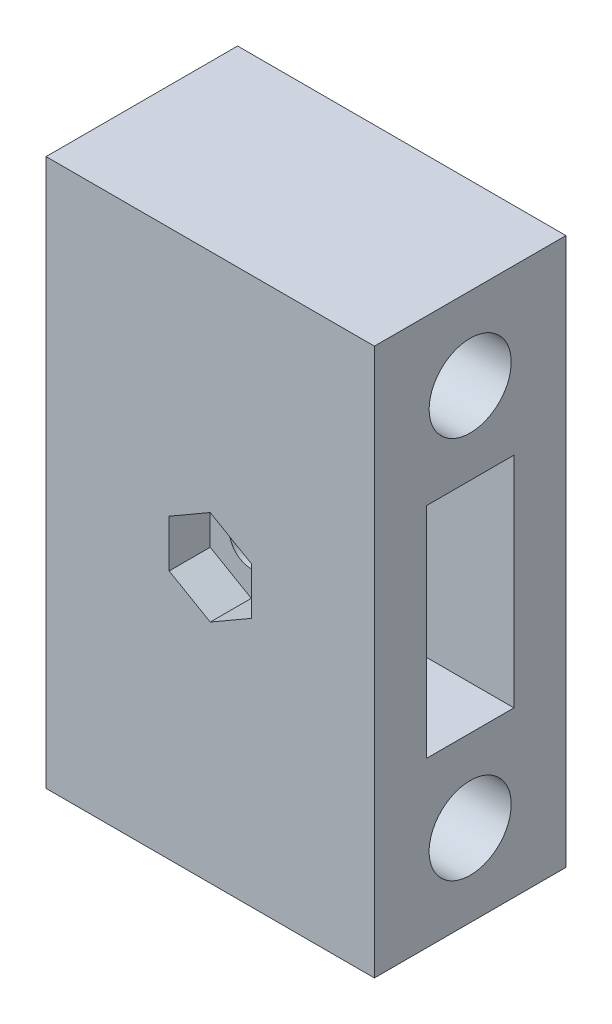
ISO-10303-21;
HEADER;
FILE_DESCRIPTION(('STEP AP214'),'2;1');
FILE_NAME('part.step','',(''),(''),'','','');
FILE_SCHEMA(('AUTOMOTIVE_DESIGN { 1 0 10303 214 1 1 1 1 }'));
ENDSEC;
DATA;
#1=APPLICATION_CONTEXT('core data for automotive mechanical design processes');
#2=APPLICATION_PROTOCOL_DEFINITION('international standard','automotive_design',2000,#1);
#3=PRODUCT_CONTEXT('',#1,'mechanical');
#4=PRODUCT('Part','Part','',(#3));
#5=PRODUCT_RELATED_PRODUCT_CATEGORY('part','',(#4));
#6=PRODUCT_DEFINITION_FORMATION('','',#4);
#7=PRODUCT_DEFINITION_CONTEXT('part definition',#1,'design');
#8=PRODUCT_DEFINITION('design','',#6,#7);
#9=PRODUCT_DEFINITION_SHAPE('','',#8);
#10=(LENGTH_UNIT() NAMED_UNIT(*) SI_UNIT(.MILLI.,.METRE.));
#11=(NAMED_UNIT(*) PLANE_ANGLE_UNIT() SI_UNIT($,.RADIAN.));
#12=(NAMED_UNIT(*) SI_UNIT($,.STERADIAN.) SOLID_ANGLE_UNIT());
#13=UNCERTAINTY_MEASURE_WITH_UNIT(LENGTH_MEASURE(1.E-05),#10,'distance_accuracy_value','');
#14=(GEOMETRIC_REPRESENTATION_CONTEXT(3) GLOBAL_UNCERTAINTY_ASSIGNED_CONTEXT((#13)) GLOBAL_UNIT_ASSIGNED_CONTEXT((#10,
#11,#12)) REPRESENTATION_CONTEXT('',''));
#15=CARTESIAN_POINT('',(0.,0.,0.));
#16=DIRECTION('',(0.,0.,1.));
#17=DIRECTION('',(1.,0.,0.));
#18=AXIS2_PLACEMENT_3D('',#15,#16,#17);
#19=CARTESIAN_POINT('',(0.,0.,-35.));
#20=DIRECTION('',(0.,0.,1.));
#21=DIRECTION('',(-1.,0.,0.));
#22=AXIS2_PLACEMENT_3D('',#19,#20,#21);
#23=CYLINDRICAL_SURFACE('',#22,4.);
#24=CARTESIAN_POINT('',(0.,0.,-9.49999999999999));
#25=DIRECTION('',(0.,0.,-1.));
#26=DIRECTION('',(-1.,0.,0.));
#27=AXIS2_PLACEMENT_3D('',#24,#25,#26);
#28=CIRCLE('',#27,4.);
#29=CARTESIAN_POINT('',(-4.,0.,-9.49999999999999));
#30=VERTEX_POINT('',#29);
#31=EDGE_CURVE('E205',#30,#30,#28,.T.);
#32=ORIENTED_EDGE('',*,*,#31,.T.);
#33=EDGE_LOOP('',(#32));
#34=FACE_BOUND('',#33,.T.);
#35=CARTESIAN_POINT('',(0.,0.,-7.5));
#36=DIRECTION('',(0.,0.,-1.));
#37=DIRECTION('',(-1.,0.,0.));
#38=AXIS2_PLACEMENT_3D('',#35,#36,#37);
#39=CIRCLE('',#38,4.);
#40=CARTESIAN_POINT('',(-4.,0.,-7.5));
#41=VERTEX_POINT('',#40);
#42=EDGE_CURVE('E41',#41,#41,#39,.F.);
#43=ORIENTED_EDGE('',*,*,#42,.T.);
#44=EDGE_LOOP('',(#43));
#45=FACE_BOUND('',#44,.T.);
#46=ADVANCED_FACE('F37',(#34,#45),#23,.F.);
#47=CARTESIAN_POINT('',(0.,0.,-25.5));
#48=DIRECTION('',(0.,0.,1.));
#49=DIRECTION('',(1.,0.,0.));
#50=AXIS2_PLACEMENT_3D('',#47,#48,#49);
#51=CIRCLE('',#50,4.);
#52=CARTESIAN_POINT('',(4.,0.,-25.5));
#53=VERTEX_POINT('',#52);
#54=EDGE_CURVE('E209',#53,#53,#51,.T.);
#55=ORIENTED_EDGE('',*,*,#54,.T.);
#56=EDGE_LOOP('',(#55));
#57=FACE_BOUND('',#56,.T.);
#58=CARTESIAN_POINT('',(0.,0.,-30.));
#59=DIRECTION('',(0.,0.,1.));
#60=DIRECTION('',(1.,0.,0.));
#61=AXIS2_PLACEMENT_3D('',#58,#59,#60);
#62=CIRCLE('',#61,4.);
#63=CARTESIAN_POINT('',(4.,0.,-30.));
#64=VERTEX_POINT('',#63);
#65=EDGE_CURVE('E201',#64,#64,#62,.F.);
#66=ORIENTED_EDGE('',*,*,#65,.T.);
#67=EDGE_LOOP('',(#66));
#68=FACE_BOUND('',#67,.T.);
#69=ADVANCED_FACE('F281',(#57,#68),#23,.F.);
#70=CARTESIAN_POINT('',(30.,-50.,-35.));
#71=DIRECTION('',(-1.,0.,0.));
#72=DIRECTION('',(0.,0.,-1.));
#73=AXIS2_PLACEMENT_3D('',#70,#71,#72);
#74=PLANE('',#73);
#75=CARTESIAN_POINT('',(30.,35.,-17.5));
#76=DIRECTION('',(-1.,0.,0.));
#77=DIRECTION('',(0.,0.,1.));
#78=AXIS2_PLACEMENT_3D('',#75,#76,#77);
#79=CIRCLE('',#78,7.5);
#80=CARTESIAN_POINT('',(30.,35.,-10.));
#81=VERTEX_POINT('',#80);
#82=EDGE_CURVE('E214',#81,#81,#79,.T.);
#83=ORIENTED_EDGE('',*,*,#82,.T.);
#84=EDGE_LOOP('',(#83));
#85=FACE_BOUND('',#84,.T.);
#86=CARTESIAN_POINT('',(30.,-35.,-17.5));
#87=DIRECTION('',(-1.,0.,0.));
#88=DIRECTION('',(0.,0.,-1.));
#89=AXIS2_PLACEMENT_3D('',#86,#87,#88);
#90=CIRCLE('',#89,7.5);
#91=CARTESIAN_POINT('',(30.,-35.,-25.));
#92=VERTEX_POINT('',#91);
#93=EDGE_CURVE('E220',#92,#92,#90,.T.);
#94=ORIENTED_EDGE('',*,*,#93,.T.);
#95=EDGE_LOOP('',(#94));
#96=FACE_BOUND('',#95,.T.);
#97=DIRECTION('',(0.,0.,-1.));
#98=VECTOR('',#97,1.);
#99=CARTESIAN_POINT('',(30.,20.,-25.5));
#100=LINE('',#99,#98);
#101=CARTESIAN_POINT('',(30.,20.,-9.49999999999999));
#102=VERTEX_POINT('',#101);
#103=CARTESIAN_POINT('',(30.,20.,-25.5));
#104=VERTEX_POINT('',#103);
#105=EDGE_CURVE('E234',#102,#104,#100,.T.);
#106=ORIENTED_EDGE('',*,*,#105,.T.);
#107=DIRECTION('',(0.,-1.,0.));
#108=VECTOR('',#107,1.);
#109=CARTESIAN_POINT('',(30.,-20.,-25.5));
#110=LINE('',#109,#108);
#111=CARTESIAN_POINT('',(30.,-20.,-25.5));
#112=VERTEX_POINT('',#111);
#113=EDGE_CURVE('E237',#104,#112,#110,.T.);
#114=ORIENTED_EDGE('',*,*,#113,.T.);
#115=DIRECTION('',(0.,0.,1.));
#116=VECTOR('',#115,1.);
#117=CARTESIAN_POINT('',(30.,-20.,-25.5));
#118=LINE('',#117,#116);
#119=CARTESIAN_POINT('',(30.,-20.,-9.49999999999999));
#120=VERTEX_POINT('',#119);
#121=EDGE_CURVE('E227',#112,#120,#118,.T.);
#122=ORIENTED_EDGE('',*,*,#121,.T.);
#123=DIRECTION('',(0.,1.,0.));
#124=VECTOR('',#123,1.);
#125=CARTESIAN_POINT('',(30.,-20.,-9.49999999999999));
#126=LINE('',#125,#124);
#127=EDGE_CURVE('E208',#120,#102,#126,.T.);
#128=ORIENTED_EDGE('',*,*,#127,.T.);
#129=EDGE_LOOP('',(#106,#114,#122,#128));
#130=FACE_BOUND('',#129,.T.);
#131=DIRECTION('',(0.,1.,0.));
#132=VECTOR('',#131,1.);
#133=CARTESIAN_POINT('',(30.,-50.,0.));
#134=LINE('',#133,#132);
#135=CARTESIAN_POINT('',(30.,-50.,0.));
#136=VERTEX_POINT('',#135);
#137=CARTESIAN_POINT('',(30.,50.,0.));
#138=VERTEX_POINT('',#137);
#139=EDGE_CURVE('E213',#136,#138,#134,.T.);
#140=ORIENTED_EDGE('',*,*,#139,.F.);
#141=DIRECTION('',(0.,0.,1.));
#142=VECTOR('',#141,1.);
#143=CARTESIAN_POINT('',(30.,-50.,-35.));
#144=LINE('',#143,#142);
#145=CARTESIAN_POINT('',(30.,-50.,-35.));
#146=VERTEX_POINT('',#145);
#147=EDGE_CURVE('E260',#146,#136,#144,.T.);
#148=ORIENTED_EDGE('',*,*,#147,.F.);
#149=DIRECTION('',(0.,1.,0.));
#150=VECTOR('',#149,1.);
#151=CARTESIAN_POINT('',(30.,-50.,-35.));
#152=LINE('',#151,#150);
#153=CARTESIAN_POINT('',(30.,50.,-35.));
#154=VERTEX_POINT('',#153);
#155=EDGE_CURVE('E248',#146,#154,#152,.T.);
#156=ORIENTED_EDGE('',*,*,#155,.T.);
#157=DIRECTION('',(0.,0.,1.));
#158=VECTOR('',#157,1.);
#159=CARTESIAN_POINT('',(30.,50.,-35.));
#160=LINE('',#159,#158);
#161=EDGE_CURVE('E11',#154,#138,#160,.T.);
#162=ORIENTED_EDGE('',*,*,#161,.T.);
#163=EDGE_LOOP('',(#140,#148,#156,#162));
#164=FACE_BOUND('',#163,.T.);
#165=ADVANCED_FACE('F39',(#85,#96,#130,#164),#74,.F.);
#166=CARTESIAN_POINT('',(-30.,50.,-35.));
#167=DIRECTION('',(0.,-1.,0.));
#168=DIRECTION('',(0.,0.,1.));
#169=AXIS2_PLACEMENT_3D('',#166,#167,#168);
#170=PLANE('',#169);
#171=DIRECTION('',(-1.,0.,0.));
#172=VECTOR('',#171,1.);
#173=CARTESIAN_POINT('',(-30.,50.,0.));
#174=LINE('',#173,#172);
#175=CARTESIAN_POINT('',(-30.,50.,0.));
#176=VERTEX_POINT('',#175);
#177=EDGE_CURVE('E263',#138,#176,#174,.T.);
#178=ORIENTED_EDGE('',*,*,#177,.F.);
#179=ORIENTED_EDGE('',*,*,#161,.F.);
#180=DIRECTION('',(-1.,0.,0.));
#181=VECTOR('',#180,1.);
#182=CARTESIAN_POINT('',(-30.,50.,-35.));
#183=LINE('',#182,#181);
#184=CARTESIAN_POINT('',(-30.,50.,-35.));
#185=VERTEX_POINT('',#184);
#186=EDGE_CURVE('E251',#154,#185,#183,.T.);
#187=ORIENTED_EDGE('',*,*,#186,.T.);
#188=DIRECTION('',(0.,0.,1.));
#189=VECTOR('',#188,1.);
#190=CARTESIAN_POINT('',(-30.,50.,-35.));
#191=LINE('',#190,#189);
#192=EDGE_CURVE('E46',#185,#176,#191,.T.);
#193=ORIENTED_EDGE('',*,*,#192,.T.);
#194=EDGE_LOOP('',(#178,#179,#187,#193));
#195=FACE_BOUND('',#194,.T.);
#196=ADVANCED_FACE('F354',(#195),#170,.F.);
#197=CARTESIAN_POINT('',(-30.,-50.,-35.));
#198=DIRECTION('',(1.,0.,0.));
#199=DIRECTION('',(0.,0.,1.));
#200=AXIS2_PLACEMENT_3D('',#197,#198,#199);
#201=PLANE('',#200);
#202=DIRECTION('',(0.,-1.,0.));
#203=VECTOR('',#202,1.);
#204=CARTESIAN_POINT('',(-30.,-50.,0.));
#205=LINE('',#204,#203);
#206=CARTESIAN_POINT('',(-30.,-50.,0.));
#207=VERTEX_POINT('',#206);
#208=EDGE_CURVE('E266',#176,#207,#205,.T.);
#209=ORIENTED_EDGE('',*,*,#208,.F.);
#210=ORIENTED_EDGE('',*,*,#192,.F.);
#211=DIRECTION('',(0.,-1.,0.));
#212=VECTOR('',#211,1.);
#213=CARTESIAN_POINT('',(-30.,-50.,-35.));
#214=LINE('',#213,#212);
#215=CARTESIAN_POINT('',(-30.,-50.,-35.));
#216=VERTEX_POINT('',#215);
#217=EDGE_CURVE('E255',#185,#216,#214,.T.);
#218=ORIENTED_EDGE('',*,*,#217,.T.);
#219=DIRECTION('',(0.,0.,1.));
#220=VECTOR('',#219,1.);
#221=CARTESIAN_POINT('',(-30.,-50.,-35.));
#222=LINE('',#221,#220);
#223=EDGE_CURVE('E272',#216,#207,#222,.T.);
#224=ORIENTED_EDGE('',*,*,#223,.T.);
#225=EDGE_LOOP('',(#209,#210,#218,#224));
#226=FACE_BOUND('',#225,.T.);
#227=ADVANCED_FACE('F351',(#226),#201,.F.);
#228=CARTESIAN_POINT('',(-30.,-50.,-35.));
#229=DIRECTION('',(0.,1.,0.));
#230=DIRECTION('',(0.,0.,-1.));
#231=AXIS2_PLACEMENT_3D('',#228,#229,#230);
#232=PLANE('',#231);
#233=DIRECTION('',(1.,0.,0.));
#234=VECTOR('',#233,1.);
#235=CARTESIAN_POINT('',(-30.,-50.,0.));
#236=LINE('',#235,#234);
#237=EDGE_CURVE('E252',#207,#136,#236,.T.);
#238=ORIENTED_EDGE('',*,*,#237,.F.);
#239=ORIENTED_EDGE('',*,*,#223,.F.);
#240=DIRECTION('',(1.,0.,0.));
#241=VECTOR('',#240,1.);
#242=CARTESIAN_POINT('',(-30.,-50.,-35.));
#243=LINE('',#242,#241);
#244=EDGE_CURVE('E258',#216,#146,#243,.T.);
#245=ORIENTED_EDGE('',*,*,#244,.T.);
#246=ORIENTED_EDGE('',*,*,#147,.T.);
#247=EDGE_LOOP('',(#238,#239,#245,#246));
#248=FACE_BOUND('',#247,.T.);
#249=ADVANCED_FACE('F344',(#248),#232,.F.);
#250=CARTESIAN_POINT('',(0.,0.,-35.));
#251=DIRECTION('',(0.,0.,1.));
#252=DIRECTION('',(-1.,0.,0.));
#253=AXIS2_PLACEMENT_3D('',#250,#251,#252);
#254=PLANE('',#253);
#255=CARTESIAN_POINT('',(0.,0.,-35.));
#256=DIRECTION('',(0.,0.,1.));
#257=DIRECTION('',(1.,0.,0.));
#258=AXIS2_PLACEMENT_3D('',#255,#256,#257);
#259=CIRCLE('',#258,6.5);
#260=CARTESIAN_POINT('',(6.5,0.,-35.));
#261=VERTEX_POINT('',#260);
#262=EDGE_CURVE('E202',#261,#261,#259,.T.);
#263=ORIENTED_EDGE('',*,*,#262,.T.);
#264=EDGE_LOOP('',(#263));
#265=FACE_BOUND('',#264,.T.);
#266=ORIENTED_EDGE('',*,*,#155,.F.);
#267=ORIENTED_EDGE('',*,*,#244,.F.);
#268=ORIENTED_EDGE('',*,*,#217,.F.);
#269=ORIENTED_EDGE('',*,*,#186,.F.);
#270=EDGE_LOOP('',(#266,#267,#268,#269));
#271=FACE_BOUND('',#270,.T.);
#272=ADVANCED_FACE('F341',(#265,#271),#254,.F.);
#273=CARTESIAN_POINT('',(0.,0.,0.));
#274=DIRECTION('',(0.,0.,1.));
#275=DIRECTION('',(-1.,0.,0.));
#276=AXIS2_PLACEMENT_3D('',#273,#274,#275);
#277=PLANE('',#276);
#278=DIRECTION('',(0.,1.,0.));
#279=VECTOR('',#278,1.);
#280=CARTESIAN_POINT('',(-7.5055,-4.33330244540274,0.));
#281=LINE('',#280,#279);
#282=CARTESIAN_POINT('',(-7.5055,-4.33330244540274,0.));
#283=VERTEX_POINT('',#282);
#284=CARTESIAN_POINT('',(-7.5055,4.33330244540274,0.));
#285=VERTEX_POINT('',#284);
#286=EDGE_CURVE('E179',#283,#285,#281,.T.);
#287=ORIENTED_EDGE('',*,*,#286,.T.);
#288=DIRECTION('',(0.866025403784438,0.5,0.));
#289=VECTOR('',#288,1.);
#290=CARTESIAN_POINT('',(-7.5055,4.33330244540274,0.));
#291=LINE('',#290,#289);
#292=CARTESIAN_POINT('',(0.,8.66660489080548,0.));
#293=VERTEX_POINT('',#292);
#294=EDGE_CURVE('E147',#285,#293,#291,.T.);
#295=ORIENTED_EDGE('',*,*,#294,.T.);
#296=DIRECTION('',(0.866025403784439,-0.5,0.));
#297=VECTOR('',#296,1.);
#298=CARTESIAN_POINT('',(0.,8.66660489080548,0.));
#299=LINE('',#298,#297);
#300=CARTESIAN_POINT('',(7.5055,4.33330244540274,0.));
#301=VERTEX_POINT('',#300);
#302=EDGE_CURVE('E182',#293,#301,#299,.T.);
#303=ORIENTED_EDGE('',*,*,#302,.T.);
#304=DIRECTION('',(0.,-1.,0.));
#305=VECTOR('',#304,1.);
#306=CARTESIAN_POINT('',(7.5055,4.33330244540274,0.));
#307=LINE('',#306,#305);
#308=CARTESIAN_POINT('',(7.5055,-4.33330244540274,0.));
#309=VERTEX_POINT('',#308);
#310=EDGE_CURVE('E185',#301,#309,#307,.T.);
#311=ORIENTED_EDGE('',*,*,#310,.T.);
#312=DIRECTION('',(-0.866025403784439,-0.5,0.));
#313=VECTOR('',#312,1.);
#314=CARTESIAN_POINT('',(7.5055,-4.33330244540274,0.));
#315=LINE('',#314,#313);
#316=CARTESIAN_POINT('',(0.,-8.66660489080548,0.));
#317=VERTEX_POINT('',#316);
#318=EDGE_CURVE('E168',#309,#317,#315,.T.);
#319=ORIENTED_EDGE('',*,*,#318,.T.);
#320=DIRECTION('',(-0.866025403784438,0.5,0.));
#321=VECTOR('',#320,1.);
#322=CARTESIAN_POINT('',(0.,-8.66660489080548,0.));
#323=LINE('',#322,#321);
#324=EDGE_CURVE('E165',#317,#283,#323,.T.);
#325=ORIENTED_EDGE('',*,*,#324,.T.);
#326=EDGE_LOOP('',(#287,#295,#303,#311,#319,#325));
#327=FACE_BOUND('',#326,.T.);
#328=ORIENTED_EDGE('',*,*,#139,.T.);
#329=ORIENTED_EDGE('',*,*,#177,.T.);
#330=ORIENTED_EDGE('',*,*,#208,.T.);
#331=ORIENTED_EDGE('',*,*,#237,.T.);
#332=EDGE_LOOP('',(#328,#329,#330,#331));
#333=FACE_BOUND('',#332,.T.);
#334=ADVANCED_FACE('F339',(#327,#333),#277,.T.);
#335=CARTESIAN_POINT('',(-25.,-20.,-9.49999999999999));
#336=DIRECTION('',(0.,0.,1.));
#337=DIRECTION('',(-1.,0.,0.));
#338=AXIS2_PLACEMENT_3D('',#335,#336,#337);
#339=PLANE('',#338);
#340=ORIENTED_EDGE('',*,*,#31,.F.);
#341=EDGE_LOOP('',(#340));
#342=FACE_BOUND('',#341,.T.);
#343=ORIENTED_EDGE('',*,*,#127,.F.);
#344=DIRECTION('',(1.,0.,0.));
#345=VECTOR('',#344,1.);
#346=CARTESIAN_POINT('',(-25.,-20.,-9.49999999999999));
#347=LINE('',#346,#345);
#348=CARTESIAN_POINT('',(-25.,-20.,-9.49999999999999));
#349=VERTEX_POINT('',#348);
#350=EDGE_CURVE('E223',#349,#120,#347,.T.);
#351=ORIENTED_EDGE('',*,*,#350,.F.);
#352=DIRECTION('',(0.,1.,0.));
#353=VECTOR('',#352,1.);
#354=CARTESIAN_POINT('',(-25.,-20.,-9.49999999999999));
#355=LINE('',#354,#353);
#356=CARTESIAN_POINT('',(-25.,20.,-9.49999999999999));
#357=VERTEX_POINT('',#356);
#358=EDGE_CURVE('E224',#349,#357,#355,.T.);
#359=ORIENTED_EDGE('',*,*,#358,.T.);
#360=DIRECTION('',(1.,0.,0.));
#361=VECTOR('',#360,1.);
#362=CARTESIAN_POINT('',(-25.,20.,-9.49999999999999));
#363=LINE('',#362,#361);
#364=EDGE_CURVE('E62',#357,#102,#363,.T.);
#365=ORIENTED_EDGE('',*,*,#364,.T.);
#366=EDGE_LOOP('',(#343,#351,#359,#365));
#367=FACE_BOUND('',#366,.T.);
#368=ADVANCED_FACE('F329',(#342,#367),#339,.F.);
#369=CARTESIAN_POINT('',(-25.,-20.,-25.5));
#370=DIRECTION('',(0.,-1.,0.));
#371=DIRECTION('',(0.,0.,1.));
#372=AXIS2_PLACEMENT_3D('',#369,#370,#371);
#373=PLANE('',#372);
#374=ORIENTED_EDGE('',*,*,#121,.F.);
#375=DIRECTION('',(1.,0.,0.));
#376=VECTOR('',#375,1.);
#377=CARTESIAN_POINT('',(-25.,-20.,-25.5));
#378=LINE('',#377,#376);
#379=CARTESIAN_POINT('',(-25.,-20.,-25.5));
#380=VERTEX_POINT('',#379);
#381=EDGE_CURVE('E243',#380,#112,#378,.T.);
#382=ORIENTED_EDGE('',*,*,#381,.F.);
#383=DIRECTION('',(0.,0.,1.));
#384=VECTOR('',#383,1.);
#385=CARTESIAN_POINT('',(-25.,-20.,-25.5));
#386=LINE('',#385,#384);
#387=EDGE_CURVE('E231',#380,#349,#386,.T.);
#388=ORIENTED_EDGE('',*,*,#387,.T.);
#389=ORIENTED_EDGE('',*,*,#350,.T.);
#390=EDGE_LOOP('',(#374,#382,#388,#389));
#391=FACE_BOUND('',#390,.T.);
#392=ADVANCED_FACE('F325',(#391),#373,.F.);
#393=CARTESIAN_POINT('',(-25.,-20.,-25.5));
#394=DIRECTION('',(0.,0.,-1.));
#395=DIRECTION('',(1.,0.,0.));
#396=AXIS2_PLACEMENT_3D('',#393,#394,#395);
#397=PLANE('',#396);
#398=ORIENTED_EDGE('',*,*,#54,.F.);
#399=EDGE_LOOP('',(#398));
#400=FACE_BOUND('',#399,.T.);
#401=ORIENTED_EDGE('',*,*,#113,.F.);
#402=DIRECTION('',(1.,0.,0.));
#403=VECTOR('',#402,1.);
#404=CARTESIAN_POINT('',(-25.,20.,-25.5));
#405=LINE('',#404,#403);
#406=CARTESIAN_POINT('',(-25.,20.,-25.5));
#407=VERTEX_POINT('',#406);
#408=EDGE_CURVE('E245',#407,#104,#405,.T.);
#409=ORIENTED_EDGE('',*,*,#408,.F.);
#410=DIRECTION('',(0.,-1.,0.));
#411=VECTOR('',#410,1.);
#412=CARTESIAN_POINT('',(-25.,-20.,-25.5));
#413=LINE('',#412,#411);
#414=EDGE_CURVE('E229',#407,#380,#413,.T.);
#415=ORIENTED_EDGE('',*,*,#414,.T.);
#416=ORIENTED_EDGE('',*,*,#381,.T.);
#417=EDGE_LOOP('',(#401,#409,#415,#416));
#418=FACE_BOUND('',#417,.T.);
#419=ADVANCED_FACE('F328',(#400,#418),#397,.F.);
#420=CARTESIAN_POINT('',(-25.,20.,-25.5));
#421=DIRECTION('',(0.,1.,0.));
#422=DIRECTION('',(0.,0.,-1.));
#423=AXIS2_PLACEMENT_3D('',#420,#421,#422);
#424=PLANE('',#423);
#425=ORIENTED_EDGE('',*,*,#105,.F.);
#426=ORIENTED_EDGE('',*,*,#364,.F.);
#427=DIRECTION('',(0.,0.,-1.));
#428=VECTOR('',#427,1.);
#429=CARTESIAN_POINT('',(-25.,20.,-25.5));
#430=LINE('',#429,#428);
#431=EDGE_CURVE('E226',#357,#407,#430,.T.);
#432=ORIENTED_EDGE('',*,*,#431,.T.);
#433=ORIENTED_EDGE('',*,*,#408,.T.);
#434=EDGE_LOOP('',(#425,#426,#432,#433));
#435=FACE_BOUND('',#434,.T.);
#436=ADVANCED_FACE('F323',(#435),#424,.F.);
#437=CARTESIAN_POINT('',(-25.,0.,0.));
#438=DIRECTION('',(-1.,0.,0.));
#439=DIRECTION('',(0.,0.,-1.));
#440=AXIS2_PLACEMENT_3D('',#437,#438,#439);
#441=PLANE('',#440);
#442=ORIENTED_EDGE('',*,*,#358,.F.);
#443=ORIENTED_EDGE('',*,*,#387,.F.);
#444=ORIENTED_EDGE('',*,*,#414,.F.);
#445=ORIENTED_EDGE('',*,*,#431,.F.);
#446=EDGE_LOOP('',(#442,#443,#444,#445));
#447=FACE_BOUND('',#446,.T.);
#448=ADVANCED_FACE('F319',(#447),#441,.F.);
#449=CARTESIAN_POINT('',(-25.,-35.,-17.5));
#450=DIRECTION('',(1.,0.,0.));
#451=DIRECTION('',(0.,0.,1.));
#452=AXIS2_PLACEMENT_3D('',#449,#450,#451);
#453=CYLINDRICAL_SURFACE('',#452,7.5);
#454=CARTESIAN_POINT('',(-25.,-35.,-17.5));
#455=DIRECTION('',(-1.,0.,0.));
#456=DIRECTION('',(0.,0.,-1.));
#457=AXIS2_PLACEMENT_3D('',#454,#455,#456);
#458=CIRCLE('',#457,7.5);
#459=CARTESIAN_POINT('',(-25.,-35.,-25.));
#460=VERTEX_POINT('',#459);
#461=EDGE_CURVE('E217',#460,#460,#458,.T.);
#462=ORIENTED_EDGE('',*,*,#461,.T.);
#463=EDGE_LOOP('',(#462));
#464=FACE_BOUND('',#463,.T.);
#465=ORIENTED_EDGE('',*,*,#93,.F.);
#466=EDGE_LOOP('',(#465));
#467=FACE_BOUND('',#466,.T.);
#468=ADVANCED_FACE('F315',(#464,#467),#453,.F.);
#469=CARTESIAN_POINT('',(-25.,-35.,-17.5));
#470=DIRECTION('',(-1.,0.,0.));
#471=DIRECTION('',(0.,0.,-1.));
#472=AXIS2_PLACEMENT_3D('',#469,#470,#471);
#473=PLANE('',#472);
#474=ORIENTED_EDGE('',*,*,#461,.F.);
#475=EDGE_LOOP('',(#474));
#476=FACE_BOUND('',#475,.T.);
#477=ADVANCED_FACE('F311',(#476),#473,.F.);
#478=CARTESIAN_POINT('',(-25.,35.,-17.5));
#479=DIRECTION('',(1.,0.,0.));
#480=DIRECTION('',(0.,0.,1.));
#481=AXIS2_PLACEMENT_3D('',#478,#479,#480);
#482=CYLINDRICAL_SURFACE('',#481,7.5);
#483=CARTESIAN_POINT('',(-25.,35.,-17.5));
#484=DIRECTION('',(-1.,0.,0.));
#485=DIRECTION('',(0.,0.,1.));
#486=AXIS2_PLACEMENT_3D('',#483,#484,#485);
#487=CIRCLE('',#486,7.5);
#488=CARTESIAN_POINT('',(-25.,35.,-10.));
#489=VERTEX_POINT('',#488);
#490=EDGE_CURVE('E210',#489,#489,#487,.T.);
#491=ORIENTED_EDGE('',*,*,#490,.T.);
#492=EDGE_LOOP('',(#491));
#493=FACE_BOUND('',#492,.T.);
#494=ORIENTED_EDGE('',*,*,#82,.F.);
#495=EDGE_LOOP('',(#494));
#496=FACE_BOUND('',#495,.T.);
#497=ADVANCED_FACE('F295',(#493,#496),#482,.F.);
#498=CARTESIAN_POINT('',(-25.,35.,-17.5));
#499=DIRECTION('',(1.,0.,0.));
#500=DIRECTION('',(0.,0.,1.));
#501=AXIS2_PLACEMENT_3D('',#498,#499,#500);
#502=PLANE('',#501);
#503=ORIENTED_EDGE('',*,*,#490,.F.);
#504=EDGE_LOOP('',(#503));
#505=FACE_BOUND('',#504,.T.);
#506=ADVANCED_FACE('F286',(#505),#502,.T.);
#507=CARTESIAN_POINT('',(0.,0.,-30.));
#508=DIRECTION('',(0.,0.,-1.));
#509=DIRECTION('',(1.,0.,0.));
#510=AXIS2_PLACEMENT_3D('',#507,#508,#509);
#511=PLANE('',#510);
#512=CARTESIAN_POINT('',(0.,0.,-30.));
#513=DIRECTION('',(0.,0.,1.));
#514=DIRECTION('',(1.,0.,0.));
#515=AXIS2_PLACEMENT_3D('',#512,#513,#514);
#516=CIRCLE('',#515,6.5);
#517=CARTESIAN_POINT('',(6.5,0.,-30.));
#518=VERTEX_POINT('',#517);
#519=EDGE_CURVE('E198',#518,#518,#516,.T.);
#520=ORIENTED_EDGE('',*,*,#519,.F.);
#521=EDGE_LOOP('',(#520));
#522=FACE_BOUND('',#521,.T.);
#523=ORIENTED_EDGE('',*,*,#65,.F.);
#524=EDGE_LOOP('',(#523));
#525=FACE_BOUND('',#524,.T.);
#526=ADVANCED_FACE('F283',(#522,#525),#511,.T.);
#527=CARTESIAN_POINT('',(0.,0.,-30.));
#528=DIRECTION('',(0.,0.,-1.));
#529=DIRECTION('',(1.,0.,0.));
#530=AXIS2_PLACEMENT_3D('',#527,#528,#529);
#531=CYLINDRICAL_SURFACE('',#530,6.5);
#532=ORIENTED_EDGE('',*,*,#519,.T.);
#533=EDGE_LOOP('',(#532));
#534=FACE_BOUND('',#533,.T.);
#535=ORIENTED_EDGE('',*,*,#262,.F.);
#536=EDGE_LOOP('',(#535));
#537=FACE_BOUND('',#536,.T.);
#538=ADVANCED_FACE('F285',(#534,#537),#531,.F.);
#539=CARTESIAN_POINT('',(0.,0.,-7.5));
#540=DIRECTION('',(0.,0.,1.));
#541=DIRECTION('',(-1.,0.,0.));
#542=AXIS2_PLACEMENT_3D('',#539,#540,#541);
#543=PLANE('',#542);
#544=DIRECTION('',(0.,1.,0.));
#545=VECTOR('',#544,1.);
#546=CARTESIAN_POINT('',(-7.5055,-4.33330244540274,-7.5));
#547=LINE('',#546,#545);
#548=CARTESIAN_POINT('',(-7.5055,-4.33330244540274,-7.5));
#549=VERTEX_POINT('',#548);
#550=CARTESIAN_POINT('',(-7.5055,4.33330244540274,-7.5));
#551=VERTEX_POINT('',#550);
#552=EDGE_CURVE('E157',#549,#551,#547,.T.);
#553=ORIENTED_EDGE('',*,*,#552,.F.);
#554=DIRECTION('',(-0.866025403784438,0.5,0.));
#555=VECTOR('',#554,1.);
#556=CARTESIAN_POINT('',(0.,-8.66660489080548,-7.5));
#557=LINE('',#556,#555);
#558=CARTESIAN_POINT('',(0.,-8.66660489080548,-7.5));
#559=VERTEX_POINT('',#558);
#560=EDGE_CURVE('E150',#559,#549,#557,.T.);
#561=ORIENTED_EDGE('',*,*,#560,.F.);
#562=DIRECTION('',(-0.866025403784439,-0.5,0.));
#563=VECTOR('',#562,1.);
#564=CARTESIAN_POINT('',(7.5055,-4.33330244540274,-7.5));
#565=LINE('',#564,#563);
#566=CARTESIAN_POINT('',(7.5055,-4.33330244540274,-7.5));
#567=VERTEX_POINT('',#566);
#568=EDGE_CURVE('E175',#567,#559,#565,.T.);
#569=ORIENTED_EDGE('',*,*,#568,.F.);
#570=DIRECTION('',(0.,-1.,0.));
#571=VECTOR('',#570,1.);
#572=CARTESIAN_POINT('',(7.5055,4.33330244540274,-7.5));
#573=LINE('',#572,#571);
#574=CARTESIAN_POINT('',(7.5055,4.33330244540274,-7.5));
#575=VERTEX_POINT('',#574);
#576=EDGE_CURVE('E172',#575,#567,#573,.T.);
#577=ORIENTED_EDGE('',*,*,#576,.F.);
#578=DIRECTION('',(0.866025403784439,-0.5,0.));
#579=VECTOR('',#578,1.);
#580=CARTESIAN_POINT('',(0.,8.66660489080548,-7.5));
#581=LINE('',#580,#579);
#582=CARTESIAN_POINT('',(0.,8.66660489080548,-7.5));
#583=VERTEX_POINT('',#582);
#584=EDGE_CURVE('E160',#583,#575,#581,.T.);
#585=ORIENTED_EDGE('',*,*,#584,.F.);
#586=DIRECTION('',(0.866025403784438,0.5,0.));
#587=VECTOR('',#586,1.);
#588=CARTESIAN_POINT('',(-7.5055,4.33330244540274,-7.5));
#589=LINE('',#588,#587);
#590=EDGE_CURVE('E144',#551,#583,#589,.T.);
#591=ORIENTED_EDGE('',*,*,#590,.F.);
#592=EDGE_LOOP('',(#553,#561,#569,#577,#585,#591));
#593=FACE_BOUND('',#592,.T.);
#594=ORIENTED_EDGE('',*,*,#42,.F.);
#595=EDGE_LOOP('',(#594));
#596=FACE_BOUND('',#595,.T.);
#597=ADVANCED_FACE('F154',(#593,#596),#543,.T.);
#598=CARTESIAN_POINT('',(-7.5055,-4.33330244540274,-7.5));
#599=DIRECTION('',(-1.,0.,0.));
#600=DIRECTION('',(0.,-1.,0.));
#601=AXIS2_PLACEMENT_3D('',#598,#599,#600);
#602=PLANE('',#601);
#603=ORIENTED_EDGE('',*,*,#286,.F.);
#604=DIRECTION('',(0.,0.,1.));
#605=VECTOR('',#604,1.);
#606=CARTESIAN_POINT('',(-7.5055,-4.33330244540274,-7.5));
#607=LINE('',#606,#605);
#608=EDGE_CURVE('E163',#549,#283,#607,.T.);
#609=ORIENTED_EDGE('',*,*,#608,.F.);
#610=ORIENTED_EDGE('',*,*,#552,.T.);
#611=DIRECTION('',(0.,0.,1.));
#612=VECTOR('',#611,1.);
#613=CARTESIAN_POINT('',(-7.5055,4.33330244540274,-7.5));
#614=LINE('',#613,#612);
#615=EDGE_CURVE('E54',#551,#285,#614,.T.);
#616=ORIENTED_EDGE('',*,*,#615,.T.);
#617=EDGE_LOOP('',(#603,#609,#610,#616));
#618=FACE_BOUND('',#617,.T.);
#619=ADVANCED_FACE('F162',(#618),#602,.F.);
#620=CARTESIAN_POINT('',(0.,-8.66660489080548,-7.5));
#621=DIRECTION('',(-0.5,-0.866025403784438,0.));
#622=DIRECTION('',(0.866025403784439,-0.5,0.));
#623=AXIS2_PLACEMENT_3D('',#620,#621,#622);
#624=PLANE('',#623);
#625=ORIENTED_EDGE('',*,*,#324,.F.);
#626=DIRECTION('',(0.,0.,1.));
#627=VECTOR('',#626,1.);
#628=CARTESIAN_POINT('',(0.,-8.66660489080548,-7.5));
#629=LINE('',#628,#627);
#630=EDGE_CURVE('E191',#559,#317,#629,.T.);
#631=ORIENTED_EDGE('',*,*,#630,.F.);
#632=ORIENTED_EDGE('',*,*,#560,.T.);
#633=ORIENTED_EDGE('',*,*,#608,.T.);
#634=EDGE_LOOP('',(#625,#631,#632,#633));
#635=FACE_BOUND('',#634,.T.);
#636=ADVANCED_FACE('F494',(#635),#624,.F.);
#637=CARTESIAN_POINT('',(7.5055,-4.33330244540274,-7.5));
#638=DIRECTION('',(0.5,-0.866025403784439,0.));
#639=DIRECTION('',(0.866025403784439,0.5,0.));
#640=AXIS2_PLACEMENT_3D('',#637,#638,#639);
#641=PLANE('',#640);
#642=ORIENTED_EDGE('',*,*,#318,.F.);
#643=DIRECTION('',(0.,0.,1.));
#644=VECTOR('',#643,1.);
#645=CARTESIAN_POINT('',(7.5055,-4.33330244540274,-7.5));
#646=LINE('',#645,#644);
#647=EDGE_CURVE('E193',#567,#309,#646,.T.);
#648=ORIENTED_EDGE('',*,*,#647,.F.);
#649=ORIENTED_EDGE('',*,*,#568,.T.);
#650=ORIENTED_EDGE('',*,*,#630,.T.);
#651=EDGE_LOOP('',(#642,#648,#649,#650));
#652=FACE_BOUND('',#651,.T.);
#653=ADVANCED_FACE('F501',(#652),#641,.F.);
#654=CARTESIAN_POINT('',(7.5055,4.33330244540274,-7.5));
#655=DIRECTION('',(1.,0.,0.));
#656=DIRECTION('',(0.,1.,0.));
#657=AXIS2_PLACEMENT_3D('',#654,#655,#656);
#658=PLANE('',#657);
#659=ORIENTED_EDGE('',*,*,#310,.F.);
#660=DIRECTION('',(0.,0.,1.));
#661=VECTOR('',#660,1.);
#662=CARTESIAN_POINT('',(7.5055,4.33330244540274,-7.5));
#663=LINE('',#662,#661);
#664=EDGE_CURVE('E195',#575,#301,#663,.T.);
#665=ORIENTED_EDGE('',*,*,#664,.F.);
#666=ORIENTED_EDGE('',*,*,#576,.T.);
#667=ORIENTED_EDGE('',*,*,#647,.T.);
#668=EDGE_LOOP('',(#659,#665,#666,#667));
#669=FACE_BOUND('',#668,.T.);
#670=ADVANCED_FACE('F510',(#669),#658,.F.);
#671=CARTESIAN_POINT('',(0.,8.66660489080548,-7.5));
#672=DIRECTION('',(0.5,0.866025403784439,0.));
#673=DIRECTION('',(-0.866025403784439,0.5,0.));
#674=AXIS2_PLACEMENT_3D('',#671,#672,#673);
#675=PLANE('',#674);
#676=ORIENTED_EDGE('',*,*,#302,.F.);
#677=DIRECTION('',(0.,0.,1.));
#678=VECTOR('',#677,1.);
#679=CARTESIAN_POINT('',(0.,8.66660489080548,-7.5));
#680=LINE('',#679,#678);
#681=EDGE_CURVE('E149',#583,#293,#680,.T.);
#682=ORIENTED_EDGE('',*,*,#681,.F.);
#683=ORIENTED_EDGE('',*,*,#584,.T.);
#684=ORIENTED_EDGE('',*,*,#664,.T.);
#685=EDGE_LOOP('',(#676,#682,#683,#684));
#686=FACE_BOUND('',#685,.T.);
#687=ADVANCED_FACE('F519',(#686),#675,.F.);
#688=CARTESIAN_POINT('',(-7.5055,4.33330244540274,-7.5));
#689=DIRECTION('',(-0.5,0.866025403784438,0.));
#690=DIRECTION('',(-0.866025403784439,-0.5,0.));
#691=AXIS2_PLACEMENT_3D('',#688,#689,#690);
#692=PLANE('',#691);
#693=ORIENTED_EDGE('',*,*,#294,.F.);
#694=ORIENTED_EDGE('',*,*,#615,.F.);
#695=ORIENTED_EDGE('',*,*,#590,.T.);
#696=ORIENTED_EDGE('',*,*,#681,.T.);
#697=EDGE_LOOP('',(#693,#694,#695,#696));
#698=FACE_BOUND('',#697,.T.);
#699=ADVANCED_FACE('F143',(#698),#692,.F.);
#700=CLOSED_SHELL('',(#46,#69,#165,#196,#227,#249,#272,#334,#368,#392,#419,#436,#448,#468,#477,
#497,#506,#526,#538,#597,#619,#636,#653,#670,#687,#699));
#701=MANIFOLD_SOLID_BREP('B2',#700);
#702=ADVANCED_BREP_SHAPE_REPRESENTATION('',(#18,#701),#14);
#703=SHAPE_DEFINITION_REPRESENTATION(#9,#702);
ENDSEC;
END-ISO-10303-21;
